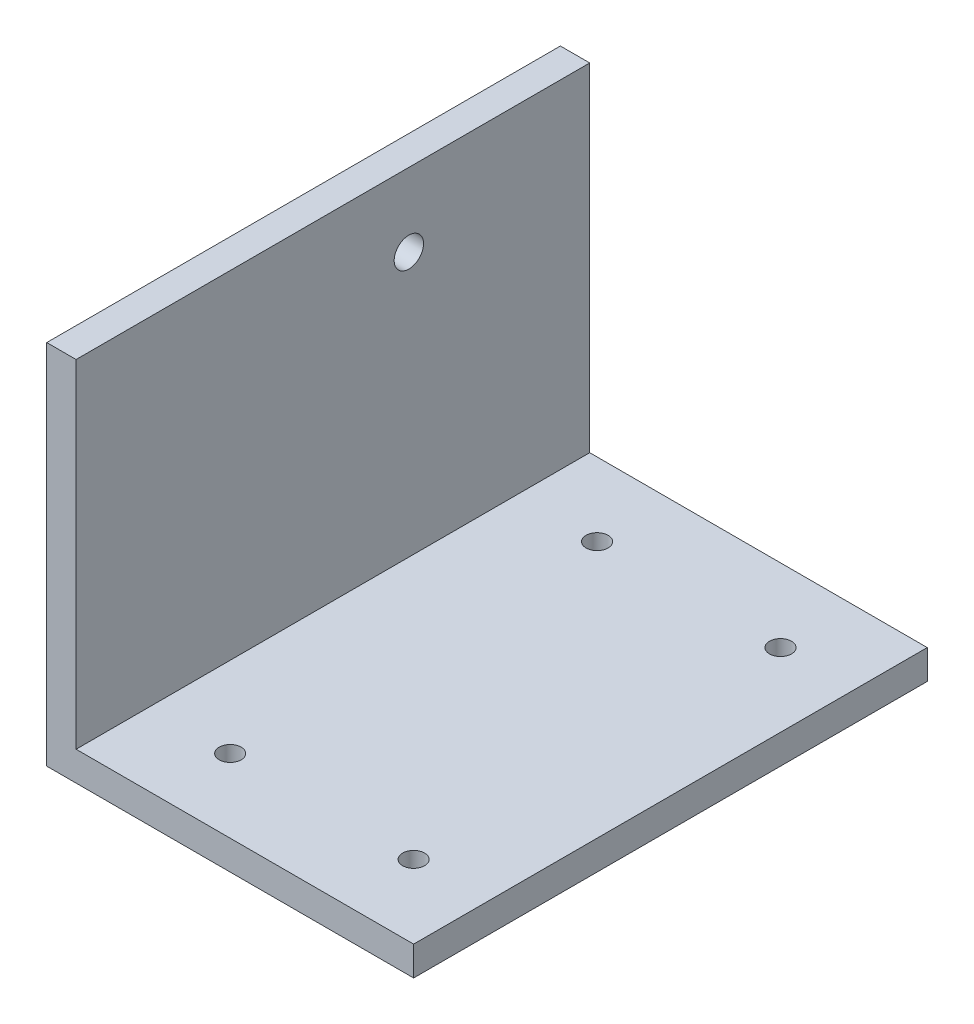
ISO-10303-21;
HEADER;
FILE_DESCRIPTION(('STEP AP214'),'2;1');
FILE_NAME('part.step','',(''),(''),'','','');
FILE_SCHEMA(('AUTOMOTIVE_DESIGN { 1 0 10303 214 1 1 1 1 }'));
ENDSEC;
DATA;
#1=APPLICATION_CONTEXT('core data for automotive mechanical design processes');
#2=APPLICATION_PROTOCOL_DEFINITION('international standard','automotive_design',2000,#1);
#3=PRODUCT_CONTEXT('',#1,'mechanical');
#4=PRODUCT('Part','Part','',(#3));
#5=PRODUCT_RELATED_PRODUCT_CATEGORY('part','',(#4));
#6=PRODUCT_DEFINITION_FORMATION('','',#4);
#7=PRODUCT_DEFINITION_CONTEXT('part definition',#1,'design');
#8=PRODUCT_DEFINITION('design','',#6,#7);
#9=PRODUCT_DEFINITION_SHAPE('','',#8);
#10=(LENGTH_UNIT() NAMED_UNIT(*) SI_UNIT(.MILLI.,.METRE.));
#11=(NAMED_UNIT(*) PLANE_ANGLE_UNIT() SI_UNIT($,.RADIAN.));
#12=(NAMED_UNIT(*) SI_UNIT($,.STERADIAN.) SOLID_ANGLE_UNIT());
#13=UNCERTAINTY_MEASURE_WITH_UNIT(LENGTH_MEASURE(1.E-05),#10,'distance_accuracy_value','');
#14=(GEOMETRIC_REPRESENTATION_CONTEXT(3) GLOBAL_UNCERTAINTY_ASSIGNED_CONTEXT((#13)) GLOBAL_UNIT_ASSIGNED_CONTEXT((#10,
#11,#12)) REPRESENTATION_CONTEXT('',''));
#15=CARTESIAN_POINT('',(0.,0.,0.));
#16=DIRECTION('',(0.,0.,1.));
#17=DIRECTION('',(1.,0.,0.));
#18=AXIS2_PLACEMENT_3D('',#15,#16,#17);
#19=CARTESIAN_POINT('',(0.,0.,70.));
#20=DIRECTION('',(1.,0.,0.));
#21=DIRECTION('',(0.,0.,-1.));
#22=AXIS2_PLACEMENT_3D('',#19,#20,#21);
#23=PLANE('',#22);
#24=CARTESIAN_POINT('',(0.,40.,24.6499999999999));
#25=DIRECTION('',(-1.,0.,0.));
#26=DIRECTION('',(0.,0.,1.));
#27=AXIS2_PLACEMENT_3D('',#24,#25,#26);
#28=CIRCLE('',#27,2.);
#29=CARTESIAN_POINT('',(0.,40.,26.6499999999999));
#30=VERTEX_POINT('',#29);
#31=EDGE_CURVE('E274',#30,#30,#28,.T.);
#32=ORIENTED_EDGE('',*,*,#31,.F.);
#33=EDGE_LOOP('',(#32));
#34=FACE_BOUND('',#33,.T.);
#35=DIRECTION('',(0.,-1.,0.));
#36=VECTOR('',#35,1.);
#37=CARTESIAN_POINT('',(0.,0.,0.));
#38=LINE('',#37,#36);
#39=CARTESIAN_POINT('',(0.,50.,0.));
#40=VERTEX_POINT('',#39);
#41=CARTESIAN_POINT('',(0.,0.,0.));
#42=VERTEX_POINT('',#41);
#43=EDGE_CURVE('E118',#40,#42,#38,.T.);
#44=ORIENTED_EDGE('',*,*,#43,.T.);
#45=DIRECTION('',(0.,0.,-1.));
#46=VECTOR('',#45,1.);
#47=CARTESIAN_POINT('',(0.,0.,70.));
#48=LINE('',#47,#46);
#49=CARTESIAN_POINT('',(0.,0.,70.));
#50=VERTEX_POINT('',#49);
#51=EDGE_CURVE('E136',#50,#42,#48,.T.);
#52=ORIENTED_EDGE('',*,*,#51,.F.);
#53=DIRECTION('',(0.,-1.,0.));
#54=VECTOR('',#53,1.);
#55=CARTESIAN_POINT('',(0.,0.,70.));
#56=LINE('',#55,#54);
#57=CARTESIAN_POINT('',(0.,50.,70.));
#58=VERTEX_POINT('',#57);
#59=EDGE_CURVE('E129',#58,#50,#56,.T.);
#60=ORIENTED_EDGE('',*,*,#59,.F.);
#61=DIRECTION('',(0.,0.,-1.));
#62=VECTOR('',#61,1.);
#63=CARTESIAN_POINT('',(0.,50.,70.));
#64=LINE('',#63,#62);
#65=EDGE_CURVE('E114',#58,#40,#64,.T.);
#66=ORIENTED_EDGE('',*,*,#65,.T.);
#67=EDGE_LOOP('',(#44,#52,#60,#66));
#68=FACE_BOUND('',#67,.T.);
#69=ADVANCED_FACE('F30',(#34,#68),#23,.F.);
#70=CARTESIAN_POINT('',(4.,0.,70.));
#71=DIRECTION('',(0.,1.,0.));
#72=DIRECTION('',(0.,0.,1.));
#73=AXIS2_PLACEMENT_3D('',#70,#71,#72);
#74=PLANE('',#73);
#75=CARTESIAN_POINT('',(40.,0.,10.));
#76=DIRECTION('',(0.,1.,0.));
#77=DIRECTION('',(0.,0.,1.));
#78=AXIS2_PLACEMENT_3D('',#75,#76,#77);
#79=CIRCLE('',#78,1.5);
#80=CARTESIAN_POINT('',(40.,0.,11.5));
#81=VERTEX_POINT('',#80);
#82=EDGE_CURVE('E277',#81,#81,#79,.T.);
#83=ORIENTED_EDGE('',*,*,#82,.T.);
#84=EDGE_LOOP('',(#83));
#85=FACE_BOUND('',#84,.T.);
#86=CARTESIAN_POINT('',(40.,0.,60.));
#87=DIRECTION('',(0.,1.,0.));
#88=DIRECTION('',(0.,0.,1.));
#89=AXIS2_PLACEMENT_3D('',#86,#87,#88);
#90=CIRCLE('',#89,1.5);
#91=CARTESIAN_POINT('',(40.,0.,61.5));
#92=VERTEX_POINT('',#91);
#93=EDGE_CURVE('E122',#92,#92,#90,.T.);
#94=ORIENTED_EDGE('',*,*,#93,.T.);
#95=EDGE_LOOP('',(#94));
#96=FACE_BOUND('',#95,.T.);
#97=DIRECTION('',(1.,0.,0.));
#98=VECTOR('',#97,1.);
#99=CARTESIAN_POINT('',(4.,0.,0.));
#100=LINE('',#99,#98);
#101=CARTESIAN_POINT('',(50.,0.,0.));
#102=VERTEX_POINT('',#101);
#103=EDGE_CURVE('E121',#42,#102,#100,.T.);
#104=ORIENTED_EDGE('',*,*,#103,.T.);
#105=DIRECTION('',(0.,0.,-1.));
#106=VECTOR('',#105,1.);
#107=CARTESIAN_POINT('',(50.,0.,70.));
#108=LINE('',#107,#106);
#109=CARTESIAN_POINT('',(50.,0.,70.));
#110=VERTEX_POINT('',#109);
#111=EDGE_CURVE('E133',#110,#102,#108,.T.);
#112=ORIENTED_EDGE('',*,*,#111,.F.);
#113=DIRECTION('',(1.,0.,0.));
#114=VECTOR('',#113,1.);
#115=CARTESIAN_POINT('',(0.,0.,70.));
#116=LINE('',#115,#114);
#117=EDGE_CURVE('E86',#50,#110,#116,.T.);
#118=ORIENTED_EDGE('',*,*,#117,.F.);
#119=ORIENTED_EDGE('',*,*,#51,.T.);
#120=EDGE_LOOP('',(#104,#112,#118,#119));
#121=FACE_BOUND('',#120,.T.);
#122=CARTESIAN_POINT('',(15.,0.,60.));
#123=DIRECTION('',(0.,1.,0.));
#124=DIRECTION('',(0.,0.,1.));
#125=AXIS2_PLACEMENT_3D('',#122,#123,#124);
#126=CIRCLE('',#125,1.5);
#127=CARTESIAN_POINT('',(15.,0.,61.5));
#128=VERTEX_POINT('',#127);
#129=EDGE_CURVE('E138',#128,#128,#126,.T.);
#130=ORIENTED_EDGE('',*,*,#129,.T.);
#131=EDGE_LOOP('',(#130));
#132=FACE_BOUND('',#131,.T.);
#133=CARTESIAN_POINT('',(15.,0.,10.));
#134=DIRECTION('',(0.,1.,0.));
#135=DIRECTION('',(0.,0.,1.));
#136=AXIS2_PLACEMENT_3D('',#133,#134,#135);
#137=CIRCLE('',#136,1.5);
#138=CARTESIAN_POINT('',(15.,0.,11.5));
#139=VERTEX_POINT('',#138);
#140=EDGE_CURVE('E40',#139,#139,#137,.T.);
#141=ORIENTED_EDGE('',*,*,#140,.T.);
#142=EDGE_LOOP('',(#141));
#143=FACE_BOUND('',#142,.T.);
#144=ADVANCED_FACE('F147',(#85,#96,#121,#132,#143),#74,.F.);
#145=CARTESIAN_POINT('',(50.,0.,70.));
#146=DIRECTION('',(-1.,0.,0.));
#147=DIRECTION('',(0.,0.,1.));
#148=AXIS2_PLACEMENT_3D('',#145,#146,#147);
#149=PLANE('',#148);
#150=DIRECTION('',(0.,1.,0.));
#151=VECTOR('',#150,1.);
#152=CARTESIAN_POINT('',(50.,0.,0.));
#153=LINE('',#152,#151);
#154=CARTESIAN_POINT('',(50.,4.,0.));
#155=VERTEX_POINT('',#154);
#156=EDGE_CURVE('E124',#102,#155,#153,.T.);
#157=ORIENTED_EDGE('',*,*,#156,.T.);
#158=DIRECTION('',(0.,0.,-1.));
#159=VECTOR('',#158,1.);
#160=CARTESIAN_POINT('',(50.,4.,70.));
#161=LINE('',#160,#159);
#162=CARTESIAN_POINT('',(50.,4.,70.));
#163=VERTEX_POINT('',#162);
#164=EDGE_CURVE('E109',#163,#155,#161,.T.);
#165=ORIENTED_EDGE('',*,*,#164,.F.);
#166=DIRECTION('',(0.,1.,0.));
#167=VECTOR('',#166,1.);
#168=CARTESIAN_POINT('',(50.,0.,70.));
#169=LINE('',#168,#167);
#170=EDGE_CURVE('E99',#110,#163,#169,.T.);
#171=ORIENTED_EDGE('',*,*,#170,.F.);
#172=ORIENTED_EDGE('',*,*,#111,.T.);
#173=EDGE_LOOP('',(#157,#165,#171,#172));
#174=FACE_BOUND('',#173,.T.);
#175=ADVANCED_FACE('F156',(#174),#149,.F.);
#176=CARTESIAN_POINT('',(4.,4.,70.));
#177=DIRECTION('',(0.,-1.,0.));
#178=DIRECTION('',(0.,0.,-1.));
#179=AXIS2_PLACEMENT_3D('',#176,#177,#178);
#180=PLANE('',#179);
#181=CARTESIAN_POINT('',(40.,4.,10.));
#182=DIRECTION('',(0.,1.,0.));
#183=DIRECTION('',(0.,0.,1.));
#184=AXIS2_PLACEMENT_3D('',#181,#182,#183);
#185=CIRCLE('',#184,1.5);
#186=CARTESIAN_POINT('',(40.,4.,11.5));
#187=VERTEX_POINT('',#186);
#188=EDGE_CURVE('E279',#187,#187,#185,.T.);
#189=ORIENTED_EDGE('',*,*,#188,.F.);
#190=EDGE_LOOP('',(#189));
#191=FACE_BOUND('',#190,.T.);
#192=CARTESIAN_POINT('',(40.,4.,60.));
#193=DIRECTION('',(0.,1.,0.));
#194=DIRECTION('',(0.,0.,1.));
#195=AXIS2_PLACEMENT_3D('',#192,#193,#194);
#196=CIRCLE('',#195,1.5);
#197=CARTESIAN_POINT('',(40.,4.,61.5));
#198=VERTEX_POINT('',#197);
#199=EDGE_CURVE('E285',#198,#198,#196,.T.);
#200=ORIENTED_EDGE('',*,*,#199,.F.);
#201=EDGE_LOOP('',(#200));
#202=FACE_BOUND('',#201,.T.);
#203=DIRECTION('',(-1.,0.,0.));
#204=VECTOR('',#203,1.);
#205=CARTESIAN_POINT('',(4.,4.,0.));
#206=LINE('',#205,#204);
#207=CARTESIAN_POINT('',(4.,4.,0.));
#208=VERTEX_POINT('',#207);
#209=EDGE_CURVE('E108',#155,#208,#206,.T.);
#210=ORIENTED_EDGE('',*,*,#209,.T.);
#211=DIRECTION('',(0.,0.,-1.));
#212=VECTOR('',#211,1.);
#213=CARTESIAN_POINT('',(4.,4.,70.));
#214=LINE('',#213,#212);
#215=CARTESIAN_POINT('',(4.,4.,70.));
#216=VERTEX_POINT('',#215);
#217=EDGE_CURVE('E104',#216,#208,#214,.T.);
#218=ORIENTED_EDGE('',*,*,#217,.F.);
#219=DIRECTION('',(-1.,0.,0.));
#220=VECTOR('',#219,1.);
#221=CARTESIAN_POINT('',(4.,4.,70.));
#222=LINE('',#221,#220);
#223=EDGE_CURVE('E93',#163,#216,#222,.T.);
#224=ORIENTED_EDGE('',*,*,#223,.F.);
#225=ORIENTED_EDGE('',*,*,#164,.T.);
#226=EDGE_LOOP('',(#210,#218,#224,#225));
#227=FACE_BOUND('',#226,.T.);
#228=CARTESIAN_POINT('',(15.,4.,60.));
#229=DIRECTION('',(0.,1.,0.));
#230=DIRECTION('',(0.,0.,1.));
#231=AXIS2_PLACEMENT_3D('',#228,#229,#230);
#232=CIRCLE('',#231,1.5);
#233=CARTESIAN_POINT('',(15.,4.,61.5));
#234=VERTEX_POINT('',#233);
#235=EDGE_CURVE('E141',#234,#234,#232,.T.);
#236=ORIENTED_EDGE('',*,*,#235,.F.);
#237=EDGE_LOOP('',(#236));
#238=FACE_BOUND('',#237,.T.);
#239=CARTESIAN_POINT('',(15.,4.,10.));
#240=DIRECTION('',(0.,1.,0.));
#241=DIRECTION('',(0.,0.,1.));
#242=AXIS2_PLACEMENT_3D('',#239,#240,#241);
#243=CIRCLE('',#242,1.5);
#244=CARTESIAN_POINT('',(15.,4.,11.5));
#245=VERTEX_POINT('',#244);
#246=EDGE_CURVE('E11',#245,#245,#243,.T.);
#247=ORIENTED_EDGE('',*,*,#246,.F.);
#248=EDGE_LOOP('',(#247));
#249=FACE_BOUND('',#248,.T.);
#250=ADVANCED_FACE('F105',(#191,#202,#227,#238,#249),#180,.F.);
#251=CARTESIAN_POINT('',(4.,4.,70.));
#252=DIRECTION('',(-1.,0.,0.));
#253=DIRECTION('',(0.,0.,1.));
#254=AXIS2_PLACEMENT_3D('',#251,#252,#253);
#255=PLANE('',#254);
#256=CARTESIAN_POINT('',(4.,40.,24.6499999999999));
#257=DIRECTION('',(-1.,0.,0.));
#258=DIRECTION('',(0.,0.,1.));
#259=AXIS2_PLACEMENT_3D('',#256,#257,#258);
#260=CIRCLE('',#259,2.);
#261=CARTESIAN_POINT('',(4.,40.,26.6499999999999));
#262=VERTEX_POINT('',#261);
#263=EDGE_CURVE('E34',#262,#262,#260,.T.);
#264=ORIENTED_EDGE('',*,*,#263,.T.);
#265=EDGE_LOOP('',(#264));
#266=FACE_BOUND('',#265,.T.);
#267=DIRECTION('',(0.,1.,0.));
#268=VECTOR('',#267,1.);
#269=CARTESIAN_POINT('',(4.,4.,0.));
#270=LINE('',#269,#268);
#271=CARTESIAN_POINT('',(4.,50.,0.));
#272=VERTEX_POINT('',#271);
#273=EDGE_CURVE('E71',#208,#272,#270,.T.);
#274=ORIENTED_EDGE('',*,*,#273,.T.);
#275=DIRECTION('',(0.,0.,-1.));
#276=VECTOR('',#275,1.);
#277=CARTESIAN_POINT('',(4.,50.,70.));
#278=LINE('',#277,#276);
#279=CARTESIAN_POINT('',(4.,50.,70.));
#280=VERTEX_POINT('',#279);
#281=EDGE_CURVE('E110',#280,#272,#278,.T.);
#282=ORIENTED_EDGE('',*,*,#281,.F.);
#283=DIRECTION('',(0.,1.,0.));
#284=VECTOR('',#283,1.);
#285=CARTESIAN_POINT('',(4.,4.,70.));
#286=LINE('',#285,#284);
#287=EDGE_CURVE('E97',#216,#280,#286,.T.);
#288=ORIENTED_EDGE('',*,*,#287,.F.);
#289=ORIENTED_EDGE('',*,*,#217,.T.);
#290=EDGE_LOOP('',(#274,#282,#288,#289));
#291=FACE_BOUND('',#290,.T.);
#292=ADVANCED_FACE('F112',(#266,#291),#255,.F.);
#293=CARTESIAN_POINT('',(0.,50.,70.));
#294=DIRECTION('',(0.,-1.,0.));
#295=DIRECTION('',(0.,0.,-1.));
#296=AXIS2_PLACEMENT_3D('',#293,#294,#295);
#297=PLANE('',#296);
#298=DIRECTION('',(-1.,0.,0.));
#299=VECTOR('',#298,1.);
#300=CARTESIAN_POINT('',(0.,50.,0.));
#301=LINE('',#300,#299);
#302=EDGE_CURVE('E77',#272,#40,#301,.T.);
#303=ORIENTED_EDGE('',*,*,#302,.T.);
#304=ORIENTED_EDGE('',*,*,#65,.F.);
#305=DIRECTION('',(-1.,0.,0.));
#306=VECTOR('',#305,1.);
#307=CARTESIAN_POINT('',(0.,50.,70.));
#308=LINE('',#307,#306);
#309=EDGE_CURVE('E48',#280,#58,#308,.T.);
#310=ORIENTED_EDGE('',*,*,#309,.F.);
#311=ORIENTED_EDGE('',*,*,#281,.T.);
#312=EDGE_LOOP('',(#303,#304,#310,#311));
#313=FACE_BOUND('',#312,.T.);
#314=ADVANCED_FACE('F163',(#313),#297,.F.);
#315=CARTESIAN_POINT('',(0.,50.,70.));
#316=DIRECTION('',(0.,0.,-1.));
#317=DIRECTION('',(-1.,0.,0.));
#318=AXIS2_PLACEMENT_3D('',#315,#316,#317);
#319=PLANE('',#318);
#320=ORIENTED_EDGE('',*,*,#59,.T.);
#321=ORIENTED_EDGE('',*,*,#117,.T.);
#322=ORIENTED_EDGE('',*,*,#170,.T.);
#323=ORIENTED_EDGE('',*,*,#223,.T.);
#324=ORIENTED_EDGE('',*,*,#287,.T.);
#325=ORIENTED_EDGE('',*,*,#309,.T.);
#326=EDGE_LOOP('',(#320,#321,#322,#323,#324,#325));
#327=FACE_BOUND('',#326,.T.);
#328=ADVANCED_FACE('F95',(#327),#319,.F.);
#329=CARTESIAN_POINT('',(0.,50.,0.));
#330=DIRECTION('',(0.,0.,-1.));
#331=DIRECTION('',(-1.,0.,0.));
#332=AXIS2_PLACEMENT_3D('',#329,#330,#331);
#333=PLANE('',#332);
#334=ORIENTED_EDGE('',*,*,#43,.F.);
#335=ORIENTED_EDGE('',*,*,#302,.F.);
#336=ORIENTED_EDGE('',*,*,#273,.F.);
#337=ORIENTED_EDGE('',*,*,#209,.F.);
#338=ORIENTED_EDGE('',*,*,#156,.F.);
#339=ORIENTED_EDGE('',*,*,#103,.F.);
#340=EDGE_LOOP('',(#334,#335,#336,#337,#338,#339));
#341=FACE_BOUND('',#340,.T.);
#342=ADVANCED_FACE('F196',(#341),#333,.T.);
#343=CARTESIAN_POINT('',(40.,0.,60.));
#344=DIRECTION('',(0.,1.,0.));
#345=DIRECTION('',(0.,0.,1.));
#346=AXIS2_PLACEMENT_3D('',#343,#344,#345);
#347=CYLINDRICAL_SURFACE('',#346,1.5);
#348=ORIENTED_EDGE('',*,*,#93,.F.);
#349=EDGE_LOOP('',(#348));
#350=FACE_BOUND('',#349,.T.);
#351=ORIENTED_EDGE('',*,*,#199,.T.);
#352=EDGE_LOOP('',(#351));
#353=FACE_BOUND('',#352,.T.);
#354=ADVANCED_FACE('F186',(#350,#353),#347,.F.);
#355=CARTESIAN_POINT('',(40.,0.,10.));
#356=DIRECTION('',(0.,1.,0.));
#357=DIRECTION('',(0.,0.,1.));
#358=AXIS2_PLACEMENT_3D('',#355,#356,#357);
#359=CYLINDRICAL_SURFACE('',#358,1.5);
#360=ORIENTED_EDGE('',*,*,#82,.F.);
#361=EDGE_LOOP('',(#360));
#362=FACE_BOUND('',#361,.T.);
#363=ORIENTED_EDGE('',*,*,#188,.T.);
#364=EDGE_LOOP('',(#363));
#365=FACE_BOUND('',#364,.T.);
#366=ADVANCED_FACE('F181',(#362,#365),#359,.F.);
#367=CARTESIAN_POINT('',(15.,0.,60.));
#368=DIRECTION('',(0.,1.,0.));
#369=DIRECTION('',(0.,0.,1.));
#370=AXIS2_PLACEMENT_3D('',#367,#368,#369);
#371=CYLINDRICAL_SURFACE('',#370,1.5);
#372=ORIENTED_EDGE('',*,*,#129,.F.);
#373=EDGE_LOOP('',(#372));
#374=FACE_BOUND('',#373,.T.);
#375=ORIENTED_EDGE('',*,*,#235,.T.);
#376=EDGE_LOOP('',(#375));
#377=FACE_BOUND('',#376,.T.);
#378=ADVANCED_FACE('F152',(#374,#377),#371,.F.);
#379=CARTESIAN_POINT('',(15.,0.,10.));
#380=DIRECTION('',(0.,1.,0.));
#381=DIRECTION('',(0.,0.,1.));
#382=AXIS2_PLACEMENT_3D('',#379,#380,#381);
#383=CYLINDRICAL_SURFACE('',#382,1.5);
#384=ORIENTED_EDGE('',*,*,#140,.F.);
#385=EDGE_LOOP('',(#384));
#386=FACE_BOUND('',#385,.T.);
#387=ORIENTED_EDGE('',*,*,#246,.T.);
#388=EDGE_LOOP('',(#387));
#389=FACE_BOUND('',#388,.T.);
#390=ADVANCED_FACE('F32',(#386,#389),#383,.F.);
#391=CARTESIAN_POINT('',(10.,40.,24.6499999999999));
#392=DIRECTION('',(-1.,0.,0.));
#393=DIRECTION('',(0.,0.,1.));
#394=AXIS2_PLACEMENT_3D('',#391,#392,#393);
#395=CYLINDRICAL_SURFACE('',#394,2.);
#396=ORIENTED_EDGE('',*,*,#31,.T.);
#397=EDGE_LOOP('',(#396));
#398=FACE_BOUND('',#397,.T.);
#399=ORIENTED_EDGE('',*,*,#263,.F.);
#400=EDGE_LOOP('',(#399));
#401=FACE_BOUND('',#400,.T.);
#402=ADVANCED_FACE('F151',(#398,#401),#395,.F.);
#403=CLOSED_SHELL('',(#69,#144,#175,#250,#292,#314,#328,#342,#354,#366,#378,#390,#402));
#404=MANIFOLD_SOLID_BREP('B2',#403);
#405=ADVANCED_BREP_SHAPE_REPRESENTATION('',(#18,#404),#14);
#406=SHAPE_DEFINITION_REPRESENTATION(#9,#405);
ENDSEC;
END-ISO-10303-21;
